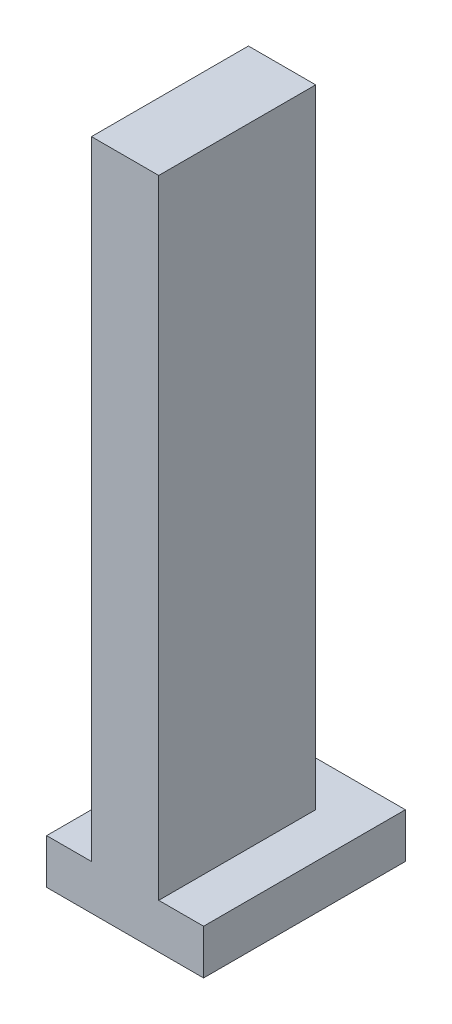
ISO-10303-21;
HEADER;
FILE_DESCRIPTION(('STEP AP214'),'2;1');
FILE_NAME('part.step','',(''),(''),'','','');
FILE_SCHEMA(('AUTOMOTIVE_DESIGN { 1 0 10303 214 1 1 1 1 }'));
ENDSEC;
DATA;
#1=APPLICATION_CONTEXT('core data for automotive mechanical design processes');
#2=APPLICATION_PROTOCOL_DEFINITION('international standard','automotive_design',2000,#1);
#3=PRODUCT_CONTEXT('',#1,'mechanical');
#4=PRODUCT('Part','Part','',(#3));
#5=PRODUCT_RELATED_PRODUCT_CATEGORY('part','',(#4));
#6=PRODUCT_DEFINITION_FORMATION('','',#4);
#7=PRODUCT_DEFINITION_CONTEXT('part definition',#1,'design');
#8=PRODUCT_DEFINITION('design','',#6,#7);
#9=PRODUCT_DEFINITION_SHAPE('','',#8);
#10=(LENGTH_UNIT() NAMED_UNIT(*) SI_UNIT(.MILLI.,.METRE.));
#11=(NAMED_UNIT(*) PLANE_ANGLE_UNIT() SI_UNIT($,.RADIAN.));
#12=(NAMED_UNIT(*) SI_UNIT($,.STERADIAN.) SOLID_ANGLE_UNIT());
#13=UNCERTAINTY_MEASURE_WITH_UNIT(LENGTH_MEASURE(1.E-05),#10,'distance_accuracy_value','');
#14=(GEOMETRIC_REPRESENTATION_CONTEXT(3) GLOBAL_UNCERTAINTY_ASSIGNED_CONTEXT((#13)) GLOBAL_UNIT_ASSIGNED_CONTEXT((#10,
#11,#12)) REPRESENTATION_CONTEXT('',''));
#15=CARTESIAN_POINT('',(0.,0.,0.));
#16=DIRECTION('',(0.,0.,1.));
#17=DIRECTION('',(1.,0.,0.));
#18=AXIS2_PLACEMENT_3D('',#15,#16,#17);
#19=CARTESIAN_POINT('',(0.749999999999999,15.,-1.75));
#20=DIRECTION('',(-1.,0.,0.));
#21=DIRECTION('',(0.,0.,1.));
#22=AXIS2_PLACEMENT_3D('',#19,#20,#21);
#23=PLANE('',#22);
#24=DIRECTION('',(0.,-1.,0.));
#25=VECTOR('',#24,1.);
#26=CARTESIAN_POINT('',(0.75,15.,1.75));
#27=LINE('',#26,#25);
#28=CARTESIAN_POINT('',(0.75,15.,1.75));
#29=VERTEX_POINT('',#28);
#30=CARTESIAN_POINT('',(0.75,1.,1.75));
#31=VERTEX_POINT('',#30);
#32=EDGE_CURVE('E148',#29,#31,#27,.T.);
#33=ORIENTED_EDGE('',*,*,#32,.T.);
#34=DIRECTION('',(0.,0.,-1.));
#35=VECTOR('',#34,1.);
#36=CARTESIAN_POINT('',(0.749999999999999,1.,-1.75));
#37=LINE('',#36,#35);
#38=CARTESIAN_POINT('',(0.749999999999999,1.,-1.75));
#39=VERTEX_POINT('',#38);
#40=EDGE_CURVE('E138',#31,#39,#37,.T.);
#41=ORIENTED_EDGE('',*,*,#40,.T.);
#42=DIRECTION('',(0.,-1.,0.));
#43=VECTOR('',#42,1.);
#44=CARTESIAN_POINT('',(0.749999999999999,15.,-1.75));
#45=LINE('',#44,#43);
#46=CARTESIAN_POINT('',(0.749999999999999,15.,-1.75));
#47=VERTEX_POINT('',#46);
#48=EDGE_CURVE('E11',#47,#39,#45,.T.);
#49=ORIENTED_EDGE('',*,*,#48,.F.);
#50=DIRECTION('',(0.,0.,-1.));
#51=VECTOR('',#50,1.);
#52=CARTESIAN_POINT('',(0.749999999999999,15.,-1.75));
#53=LINE('',#52,#51);
#54=EDGE_CURVE('E141',#29,#47,#53,.T.);
#55=ORIENTED_EDGE('',*,*,#54,.F.);
#56=EDGE_LOOP('',(#33,#41,#49,#55));
#57=FACE_BOUND('',#56,.T.);
#58=ADVANCED_FACE('F33',(#57),#23,.F.);
#59=CARTESIAN_POINT('',(-0.750000000000001,15.,-1.75));
#60=DIRECTION('',(0.,0.,1.));
#61=DIRECTION('',(1.,0.,0.));
#62=AXIS2_PLACEMENT_3D('',#59,#60,#61);
#63=PLANE('',#62);
#64=ORIENTED_EDGE('',*,*,#48,.T.);
#65=DIRECTION('',(-1.,0.,0.));
#66=VECTOR('',#65,1.);
#67=CARTESIAN_POINT('',(-0.750000000000001,1.,-1.75));
#68=LINE('',#67,#66);
#69=CARTESIAN_POINT('',(-0.750000000000001,1.,-1.75));
#70=VERTEX_POINT('',#69);
#71=EDGE_CURVE('E135',#39,#70,#68,.T.);
#72=ORIENTED_EDGE('',*,*,#71,.T.);
#73=DIRECTION('',(0.,-1.,0.));
#74=VECTOR('',#73,1.);
#75=CARTESIAN_POINT('',(-0.750000000000001,15.,-1.75));
#76=LINE('',#75,#74);
#77=CARTESIAN_POINT('',(-0.750000000000001,15.,-1.75));
#78=VERTEX_POINT('',#77);
#79=EDGE_CURVE('E40',#78,#70,#76,.T.);
#80=ORIENTED_EDGE('',*,*,#79,.F.);
#81=DIRECTION('',(-1.,0.,0.));
#82=VECTOR('',#81,1.);
#83=CARTESIAN_POINT('',(-0.750000000000001,15.,-1.75));
#84=LINE('',#83,#82);
#85=EDGE_CURVE('E143',#47,#78,#84,.T.);
#86=ORIENTED_EDGE('',*,*,#85,.F.);
#87=EDGE_LOOP('',(#64,#72,#80,#86));
#88=FACE_BOUND('',#87,.T.);
#89=ADVANCED_FACE('F159',(#88),#63,.F.);
#90=CARTESIAN_POINT('',(-0.750000000000001,15.,-1.75));
#91=DIRECTION('',(1.,0.,0.));
#92=DIRECTION('',(0.,0.,-1.));
#93=AXIS2_PLACEMENT_3D('',#90,#91,#92);
#94=PLANE('',#93);
#95=ORIENTED_EDGE('',*,*,#79,.T.);
#96=DIRECTION('',(0.,0.,1.));
#97=VECTOR('',#96,1.);
#98=CARTESIAN_POINT('',(-0.750000000000001,1.,-1.75));
#99=LINE('',#98,#97);
#100=CARTESIAN_POINT('',(-0.75,1.,1.75));
#101=VERTEX_POINT('',#100);
#102=EDGE_CURVE('E132',#70,#101,#99,.T.);
#103=ORIENTED_EDGE('',*,*,#102,.T.);
#104=DIRECTION('',(0.,-1.,0.));
#105=VECTOR('',#104,1.);
#106=CARTESIAN_POINT('',(-0.75,15.,1.75));
#107=LINE('',#106,#105);
#108=CARTESIAN_POINT('',(-0.75,15.,1.75));
#109=VERTEX_POINT('',#108);
#110=EDGE_CURVE('E151',#109,#101,#107,.T.);
#111=ORIENTED_EDGE('',*,*,#110,.F.);
#112=DIRECTION('',(0.,0.,1.));
#113=VECTOR('',#112,1.);
#114=CARTESIAN_POINT('',(-0.750000000000001,15.,-1.75));
#115=LINE('',#114,#113);
#116=EDGE_CURVE('E145',#78,#109,#115,.T.);
#117=ORIENTED_EDGE('',*,*,#116,.F.);
#118=EDGE_LOOP('',(#95,#103,#111,#117));
#119=FACE_BOUND('',#118,.T.);
#120=ADVANCED_FACE('F156',(#119),#94,.F.);
#121=CARTESIAN_POINT('',(-0.75,15.,1.75));
#122=DIRECTION('',(0.,0.,-1.));
#123=DIRECTION('',(-1.,0.,0.));
#124=AXIS2_PLACEMENT_3D('',#121,#122,#123);
#125=PLANE('',#124);
#126=ORIENTED_EDGE('',*,*,#110,.T.);
#127=DIRECTION('',(-1.,0.,0.));
#128=VECTOR('',#127,1.);
#129=CARTESIAN_POINT('',(1.75,1.,1.75));
#130=LINE('',#129,#128);
#131=CARTESIAN_POINT('',(-1.75,1.,1.75));
#132=VERTEX_POINT('',#131);
#133=EDGE_CURVE('E166',#101,#132,#130,.T.);
#134=ORIENTED_EDGE('',*,*,#133,.T.);
#135=DIRECTION('',(0.,1.,0.));
#136=VECTOR('',#135,1.);
#137=CARTESIAN_POINT('',(-1.75,0.,1.75));
#138=LINE('',#137,#136);
#139=CARTESIAN_POINT('',(-1.75,0.,1.75));
#140=VERTEX_POINT('',#139);
#141=EDGE_CURVE('E47',#140,#132,#138,.T.);
#142=ORIENTED_EDGE('',*,*,#141,.F.);
#143=DIRECTION('',(-1.,0.,0.));
#144=VECTOR('',#143,1.);
#145=CARTESIAN_POINT('',(1.75,0.,1.75));
#146=LINE('',#145,#144);
#147=CARTESIAN_POINT('',(1.75,0.,1.75));
#148=VERTEX_POINT('',#147);
#149=EDGE_CURVE('E95',#148,#140,#146,.T.);
#150=ORIENTED_EDGE('',*,*,#149,.F.);
#151=DIRECTION('',(0.,1.,0.));
#152=VECTOR('',#151,1.);
#153=CARTESIAN_POINT('',(1.75,0.,1.75));
#154=LINE('',#153,#152);
#155=CARTESIAN_POINT('',(1.75,1.,1.75));
#156=VERTEX_POINT('',#155);
#157=EDGE_CURVE('E99',#148,#156,#154,.T.);
#158=ORIENTED_EDGE('',*,*,#157,.T.);
#159=EDGE_CURVE('E105',#156,#31,#130,.T.);
#160=ORIENTED_EDGE('',*,*,#159,.T.);
#161=ORIENTED_EDGE('',*,*,#32,.F.);
#162=DIRECTION('',(1.,0.,0.));
#163=VECTOR('',#162,1.);
#164=CARTESIAN_POINT('',(-0.75,15.,1.75));
#165=LINE('',#164,#163);
#166=EDGE_CURVE('E55',#109,#29,#165,.T.);
#167=ORIENTED_EDGE('',*,*,#166,.F.);
#168=EDGE_LOOP('',(#126,#134,#142,#150,#158,#160,#161,#167));
#169=FACE_BOUND('',#168,.T.);
#170=ADVANCED_FACE('F98',(#169),#125,.F.);
#171=CARTESIAN_POINT('',(0.,15.,0.));
#172=DIRECTION('',(0.,1.,0.));
#173=DIRECTION('',(0.,0.,1.));
#174=AXIS2_PLACEMENT_3D('',#171,#172,#173);
#175=PLANE('',#174);
#176=ORIENTED_EDGE('',*,*,#54,.T.);
#177=ORIENTED_EDGE('',*,*,#85,.T.);
#178=ORIENTED_EDGE('',*,*,#116,.T.);
#179=ORIENTED_EDGE('',*,*,#166,.T.);
#180=EDGE_LOOP('',(#176,#177,#178,#179));
#181=FACE_BOUND('',#180,.T.);
#182=ADVANCED_FACE('F200',(#181),#175,.T.);
#183=CARTESIAN_POINT('',(0.,1.,0.));
#184=DIRECTION('',(0.,1.,0.));
#185=DIRECTION('',(0.,0.,1.));
#186=AXIS2_PLACEMENT_3D('',#183,#184,#185);
#187=PLANE('',#186);
#188=ORIENTED_EDGE('',*,*,#159,.F.);
#189=DIRECTION('',(0.,0.,-1.));
#190=VECTOR('',#189,1.);
#191=CARTESIAN_POINT('',(1.75,1.,-2.75));
#192=LINE('',#191,#190);
#193=CARTESIAN_POINT('',(1.75,1.,-2.75));
#194=VERTEX_POINT('',#193);
#195=EDGE_CURVE('E113',#156,#194,#192,.T.);
#196=ORIENTED_EDGE('',*,*,#195,.T.);
#197=DIRECTION('',(-1.,0.,0.));
#198=VECTOR('',#197,1.);
#199=CARTESIAN_POINT('',(-1.75,1.,-2.75));
#200=LINE('',#199,#198);
#201=CARTESIAN_POINT('',(-1.75,1.,-2.75));
#202=VERTEX_POINT('',#201);
#203=EDGE_CURVE('E169',#194,#202,#200,.T.);
#204=ORIENTED_EDGE('',*,*,#203,.T.);
#205=DIRECTION('',(0.,0.,1.));
#206=VECTOR('',#205,1.);
#207=CARTESIAN_POINT('',(-1.75,1.,-2.75));
#208=LINE('',#207,#206);
#209=EDGE_CURVE('E123',#202,#132,#208,.T.);
#210=ORIENTED_EDGE('',*,*,#209,.T.);
#211=ORIENTED_EDGE('',*,*,#133,.F.);
#212=ORIENTED_EDGE('',*,*,#102,.F.);
#213=ORIENTED_EDGE('',*,*,#71,.F.);
#214=ORIENTED_EDGE('',*,*,#40,.F.);
#215=EDGE_LOOP('',(#188,#196,#204,#210,#211,#212,#213,#214));
#216=FACE_BOUND('',#215,.T.);
#217=ADVANCED_FACE('F163',(#216),#187,.T.);
#218=CARTESIAN_POINT('',(1.75,1.,-2.75));
#219=DIRECTION('',(-1.,0.,0.));
#220=DIRECTION('',(0.,0.,1.));
#221=AXIS2_PLACEMENT_3D('',#218,#219,#220);
#222=PLANE('',#221);
#223=ORIENTED_EDGE('',*,*,#195,.F.);
#224=ORIENTED_EDGE('',*,*,#157,.F.);
#225=DIRECTION('',(0.,0.,-1.));
#226=VECTOR('',#225,1.);
#227=CARTESIAN_POINT('',(1.75,0.,-2.75));
#228=LINE('',#227,#226);
#229=CARTESIAN_POINT('',(1.75,0.,-2.75));
#230=VERTEX_POINT('',#229);
#231=EDGE_CURVE('E111',#148,#230,#228,.T.);
#232=ORIENTED_EDGE('',*,*,#231,.T.);
#233=DIRECTION('',(0.,-1.,0.));
#234=VECTOR('',#233,1.);
#235=CARTESIAN_POINT('',(1.75,1.,-2.75));
#236=LINE('',#235,#234);
#237=EDGE_CURVE('E130',#194,#230,#236,.T.);
#238=ORIENTED_EDGE('',*,*,#237,.F.);
#239=EDGE_LOOP('',(#223,#224,#232,#238));
#240=FACE_BOUND('',#239,.T.);
#241=ADVANCED_FACE('F109',(#240),#222,.F.);
#242=CARTESIAN_POINT('',(-1.75,1.,-2.75));
#243=DIRECTION('',(0.,0.,1.));
#244=DIRECTION('',(1.,0.,0.));
#245=AXIS2_PLACEMENT_3D('',#242,#243,#244);
#246=PLANE('',#245);
#247=DIRECTION('',(-1.,0.,0.));
#248=VECTOR('',#247,1.);
#249=CARTESIAN_POINT('',(-1.75,0.,-2.75));
#250=LINE('',#249,#248);
#251=CARTESIAN_POINT('',(-1.75,0.,-2.75));
#252=VERTEX_POINT('',#251);
#253=EDGE_CURVE('E116',#230,#252,#250,.T.);
#254=ORIENTED_EDGE('',*,*,#253,.T.);
#255=DIRECTION('',(0.,-1.,0.));
#256=VECTOR('',#255,1.);
#257=CARTESIAN_POINT('',(-1.75,1.,-2.75));
#258=LINE('',#257,#256);
#259=EDGE_CURVE('E127',#202,#252,#258,.T.);
#260=ORIENTED_EDGE('',*,*,#259,.F.);
#261=ORIENTED_EDGE('',*,*,#203,.F.);
#262=ORIENTED_EDGE('',*,*,#237,.T.);
#263=EDGE_LOOP('',(#254,#260,#261,#262));
#264=FACE_BOUND('',#263,.T.);
#265=ADVANCED_FACE('F177',(#264),#246,.F.);
#266=CARTESIAN_POINT('',(-1.75,1.,-2.75));
#267=DIRECTION('',(1.,0.,0.));
#268=DIRECTION('',(0.,0.,-1.));
#269=AXIS2_PLACEMENT_3D('',#266,#267,#268);
#270=PLANE('',#269);
#271=DIRECTION('',(0.,0.,1.));
#272=VECTOR('',#271,1.);
#273=CARTESIAN_POINT('',(-1.75,0.,-2.75));
#274=LINE('',#273,#272);
#275=EDGE_CURVE('E119',#252,#140,#274,.T.);
#276=ORIENTED_EDGE('',*,*,#275,.T.);
#277=ORIENTED_EDGE('',*,*,#141,.T.);
#278=ORIENTED_EDGE('',*,*,#209,.F.);
#279=ORIENTED_EDGE('',*,*,#259,.T.);
#280=EDGE_LOOP('',(#276,#277,#278,#279));
#281=FACE_BOUND('',#280,.T.);
#282=ADVANCED_FACE('F175',(#281),#270,.F.);
#283=CARTESIAN_POINT('',(0.,0.,0.));
#284=DIRECTION('',(0.,1.,0.));
#285=DIRECTION('',(0.,0.,1.));
#286=AXIS2_PLACEMENT_3D('',#283,#284,#285);
#287=PLANE('',#286);
#288=ORIENTED_EDGE('',*,*,#231,.F.);
#289=ORIENTED_EDGE('',*,*,#149,.T.);
#290=ORIENTED_EDGE('',*,*,#275,.F.);
#291=ORIENTED_EDGE('',*,*,#253,.F.);
#292=EDGE_LOOP('',(#288,#289,#290,#291));
#293=FACE_BOUND('',#292,.T.);
#294=ADVANCED_FACE('F115',(#293),#287,.F.);
#295=CLOSED_SHELL('',(#58,#89,#120,#170,#182,#217,#241,#265,#282,#294));
#296=MANIFOLD_SOLID_BREP('B2',#295);
#297=ADVANCED_BREP_SHAPE_REPRESENTATION('',(#18,#296),#14);
#298=SHAPE_DEFINITION_REPRESENTATION(#9,#297);
ENDSEC;
END-ISO-10303-21;
